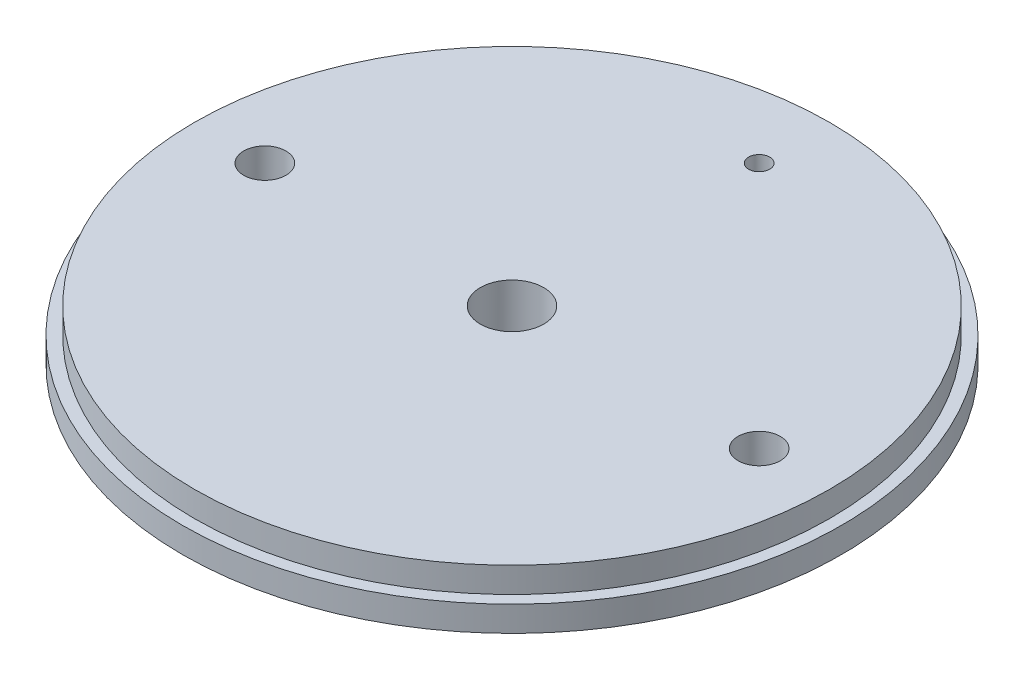
ISO-10303-21;
HEADER;
FILE_DESCRIPTION(('STEP AP214'),'2;1');
FILE_NAME('part.step','',(''),(''),'','','');
FILE_SCHEMA(('AUTOMOTIVE_DESIGN { 1 0 10303 214 1 1 1 1 }'));
ENDSEC;
DATA;
#1=APPLICATION_CONTEXT('core data for automotive mechanical design processes');
#2=APPLICATION_PROTOCOL_DEFINITION('international standard','automotive_design',2000,#1);
#3=PRODUCT_CONTEXT('',#1,'mechanical');
#4=PRODUCT('Part','Part','',(#3));
#5=PRODUCT_RELATED_PRODUCT_CATEGORY('part','',(#4));
#6=PRODUCT_DEFINITION_FORMATION('','',#4);
#7=PRODUCT_DEFINITION_CONTEXT('part definition',#1,'design');
#8=PRODUCT_DEFINITION('design','',#6,#7);
#9=PRODUCT_DEFINITION_SHAPE('','',#8);
#10=(LENGTH_UNIT() NAMED_UNIT(*) SI_UNIT(.MILLI.,.METRE.));
#11=(NAMED_UNIT(*) PLANE_ANGLE_UNIT() SI_UNIT($,.RADIAN.));
#12=(NAMED_UNIT(*) SI_UNIT($,.STERADIAN.) SOLID_ANGLE_UNIT());
#13=UNCERTAINTY_MEASURE_WITH_UNIT(LENGTH_MEASURE(1.E-05),#10,'distance_accuracy_value','');
#14=(GEOMETRIC_REPRESENTATION_CONTEXT(3) GLOBAL_UNCERTAINTY_ASSIGNED_CONTEXT((#13)) GLOBAL_UNIT_ASSIGNED_CONTEXT((#10,
#11,#12)) REPRESENTATION_CONTEXT('',''));
#15=CARTESIAN_POINT('',(0.,0.,0.));
#16=DIRECTION('',(0.,0.,1.));
#17=DIRECTION('',(1.,0.,0.));
#18=AXIS2_PLACEMENT_3D('',#15,#16,#17);
#19=CARTESIAN_POINT('',(0.,3.81,0.));
#20=DIRECTION('',(0.,-1.,0.));
#21=DIRECTION('',(0.,0.,-1.));
#22=AXIS2_PLACEMENT_3D('',#19,#20,#21);
#23=CYLINDRICAL_SURFACE('',#22,49.53);
#24=CARTESIAN_POINT('',(0.,3.81,0.));
#25=DIRECTION('',(0.,1.,0.));
#26=DIRECTION('',(0.,0.,1.));
#27=AXIS2_PLACEMENT_3D('',#24,#25,#26);
#28=CIRCLE('',#27,49.53);
#29=CARTESIAN_POINT('',(0.,3.81,-49.53));
#30=VERTEX_POINT('',#29);
#31=EDGE_CURVE('E50',#30,#30,#28,.T.);
#32=CARTESIAN_POINT('',(0.,0.,0.));
#33=DIRECTION('',(0.,1.,0.));
#34=DIRECTION('',(0.,0.,1.));
#35=AXIS2_PLACEMENT_3D('',#32,#33,#34);
#36=CIRCLE('',#35,49.53);
#37=CARTESIAN_POINT('',(0.,0.,-49.53));
#38=VERTEX_POINT('',#37);
#39=EDGE_CURVE('E56',#38,#38,#36,.T.);
#40=CARTESIAN_POINT('',(0.,3.81,-49.53));
#41=CARTESIAN_POINT('',(0.,3.7703125,-49.53));
#42=CARTESIAN_POINT('',(0.,3.730625,-49.53));
#43=CARTESIAN_POINT('',(0.,3.65125,-49.53));
#44=CARTESIAN_POINT('',(0.,3.6115625,-49.53));
#45=CARTESIAN_POINT('',(0.,3.5321875,-49.53));
#46=CARTESIAN_POINT('',(0.,3.4925,-49.53));
#47=CARTESIAN_POINT('',(0.,3.413125,-49.53));
#48=CARTESIAN_POINT('',(0.,3.3734375,-49.53));
#49=CARTESIAN_POINT('',(0.,3.2940625,-49.53));
#50=CARTESIAN_POINT('',(0.,3.254375,-49.53));
#51=CARTESIAN_POINT('',(0.,3.175,-49.53));
#52=CARTESIAN_POINT('',(0.,3.1353125,-49.53));
#53=CARTESIAN_POINT('',(0.,3.0559375,-49.53));
#54=CARTESIAN_POINT('',(0.,3.01625,-49.53));
#55=CARTESIAN_POINT('',(0.,2.936875,-49.53));
#56=CARTESIAN_POINT('',(0.,2.8971875,-49.53));
#57=CARTESIAN_POINT('',(0.,2.8178125,-49.53));
#58=CARTESIAN_POINT('',(0.,2.778125,-49.53));
#59=CARTESIAN_POINT('',(0.,2.69875,-49.53));
#60=CARTESIAN_POINT('',(0.,2.6590625,-49.53));
#61=CARTESIAN_POINT('',(0.,2.5796875,-49.53));
#62=CARTESIAN_POINT('',(0.,2.54,-49.53));
#63=CARTESIAN_POINT('',(0.,2.460625,-49.53));
#64=CARTESIAN_POINT('',(0.,2.4209375,-49.53));
#65=CARTESIAN_POINT('',(0.,2.3415625,-49.53));
#66=CARTESIAN_POINT('',(0.,2.301875,-49.53));
#67=CARTESIAN_POINT('',(0.,2.2225,-49.53));
#68=CARTESIAN_POINT('',(0.,2.1828125,-49.53));
#69=CARTESIAN_POINT('',(0.,2.1034375,-49.53));
#70=CARTESIAN_POINT('',(0.,2.06375,-49.53));
#71=CARTESIAN_POINT('',(0.,1.984375,-49.53));
#72=CARTESIAN_POINT('',(0.,1.9446875,-49.53));
#73=CARTESIAN_POINT('',(0.,1.8653125,-49.53));
#74=CARTESIAN_POINT('',(0.,1.825625,-49.53));
#75=CARTESIAN_POINT('',(0.,1.74625,-49.53));
#76=CARTESIAN_POINT('',(0.,1.7065625,-49.53));
#77=CARTESIAN_POINT('',(0.,1.6271875,-49.53));
#78=CARTESIAN_POINT('',(0.,1.5875,-49.53));
#79=CARTESIAN_POINT('',(0.,1.508125,-49.53));
#80=CARTESIAN_POINT('',(0.,1.4684375,-49.53));
#81=CARTESIAN_POINT('',(0.,1.3890625,-49.53));
#82=CARTESIAN_POINT('',(0.,1.349375,-49.53));
#83=CARTESIAN_POINT('',(0.,1.27,-49.53));
#84=CARTESIAN_POINT('',(0.,1.2303125,-49.53));
#85=CARTESIAN_POINT('',(0.,1.1509375,-49.53));
#86=CARTESIAN_POINT('',(0.,1.11125,-49.53));
#87=CARTESIAN_POINT('',(0.,1.031875,-49.53));
#88=CARTESIAN_POINT('',(0.,0.9921875,-49.53));
#89=CARTESIAN_POINT('',(0.,0.9128125,-49.53));
#90=CARTESIAN_POINT('',(0.,0.873125,-49.53));
#91=CARTESIAN_POINT('',(0.,0.79375,-49.53));
#92=CARTESIAN_POINT('',(0.,0.7540625,-49.53));
#93=CARTESIAN_POINT('',(0.,0.6746875,-49.53));
#94=CARTESIAN_POINT('',(0.,0.635,-49.53));
#95=CARTESIAN_POINT('',(0.,0.555625,-49.53));
#96=CARTESIAN_POINT('',(0.,0.5159375,-49.53));
#97=CARTESIAN_POINT('',(0.,0.4365625,-49.53));
#98=CARTESIAN_POINT('',(0.,0.396875,-49.53));
#99=CARTESIAN_POINT('',(0.,0.3175,-49.53));
#100=CARTESIAN_POINT('',(0.,0.2778125,-49.53));
#101=CARTESIAN_POINT('',(0.,0.1984375,-49.53));
#102=CARTESIAN_POINT('',(0.,0.15875,-49.53));
#103=CARTESIAN_POINT('',(0.,0.0793749999999999,-49.53));
#104=CARTESIAN_POINT('',(0.,0.0396874999999999,-49.53));
#105=CARTESIAN_POINT('',(0.,0.,-49.53));
#106=B_SPLINE_CURVE_WITH_KNOTS('',3,(#40,#41,#42,#43,#44,#45,#46,#47,#48,#49,#50,#51,#52,#53,
#54,#55,#56,#57,#58,#59,#60,#61,#62,#63,#64,#65,#66,#67,#68,#69,#70,#71,#72,#73,#74,#75,#76,#77,
#78,#79,#80,#81,#82,#83,#84,#85,#86,#87,#88,#89,#90,#91,#92,#93,#94,#95,#96,#97,#98,#99,#100,
#101,#102,#103,#104,#105),.UNSPECIFIED.,.F.,.F.,(4,2,2,2,2,2,2,2,2,2,2,2,2,2,2,2,2,2,2,2,2,2,2,
2,2,2,2,2,2,2,2,2,4),(0.,0.1190625,0.238125,0.3571875,0.47625,0.5953125,0.714375,0.8334375,
0.9525,1.0715625,1.190625,1.3096875,1.42875,1.5478125,1.666875,1.7859375,1.905,2.0240625,
2.143125,2.2621875,2.38125,2.5003125,2.619375,2.7384375,2.8575,2.9765625,3.095625,3.2146875,
3.33375,3.4528125,3.571875,3.6909375,3.81),.UNSPECIFIED.);
#107=EDGE_CURVE('BSEAM42',#30,#38,#106,.T.);
#108=ORIENTED_EDGE('',*,*,#31,.F.);
#109=ORIENTED_EDGE('',*,*,#39,.T.);
#110=ORIENTED_EDGE('',*,*,#107,.T.);
#111=ORIENTED_EDGE('',*,*,#107,.F.);
#112=EDGE_LOOP('',(#108,#110,#109,#111));
#113=FACE_BOUND('',#112,.T.);
#114=ADVANCED_FACE('F42',(#113),#23,.T.);
#115=CARTESIAN_POINT('',(0.,3.81,0.));
#116=DIRECTION('',(0.,1.,0.));
#117=DIRECTION('',(0.,0.,1.));
#118=AXIS2_PLACEMENT_3D('',#115,#116,#117);
#119=PLANE('',#118);
#120=CARTESIAN_POINT('',(0.,3.81,0.));
#121=DIRECTION('',(0.,1.,0.));
#122=DIRECTION('',(0.,0.,1.));
#123=AXIS2_PLACEMENT_3D('',#120,#121,#122);
#124=CIRCLE('',#123,47.752);
#125=CARTESIAN_POINT('',(0.,3.81,-47.752));
#126=VERTEX_POINT('',#125);
#127=EDGE_CURVE('E10',#126,#126,#124,.T.);
#128=ORIENTED_EDGE('',*,*,#127,.F.);
#129=EDGE_LOOP('',(#128));
#130=FACE_BOUND('',#129,.T.);
#131=ORIENTED_EDGE('',*,*,#31,.T.);
#132=EDGE_LOOP('',(#131));
#133=FACE_BOUND('',#132,.T.);
#134=ADVANCED_FACE('F97',(#130,#133),#119,.T.);
#135=CARTESIAN_POINT('',(0.,0.,0.));
#136=DIRECTION('',(0.,1.,0.));
#137=DIRECTION('',(0.,0.,1.));
#138=AXIS2_PLACEMENT_3D('',#135,#136,#137);
#139=PLANE('',#138);
#140=CARTESIAN_POINT('',(0.,0.,-37.1475));
#141=DIRECTION('',(0.,-1.,0.));
#142=DIRECTION('',(0.,0.,-1.));
#143=AXIS2_PLACEMENT_3D('',#140,#141,#142);
#144=CIRCLE('',#143,1.5875);
#145=CARTESIAN_POINT('',(0.,0.,-38.735));
#146=VERTEX_POINT('',#145);
#147=EDGE_CURVE('E177',#146,#146,#144,.T.);
#148=ORIENTED_EDGE('',*,*,#147,.F.);
#149=EDGE_LOOP('',(#148));
#150=FACE_BOUND('',#149,.T.);
#151=CARTESIAN_POINT('',(-37.1475,0.,0.));
#152=DIRECTION('',(0.,-1.,0.));
#153=DIRECTION('',(0.,0.,-1.));
#154=AXIS2_PLACEMENT_3D('',#151,#152,#153);
#155=CIRCLE('',#154,3.175);
#156=CARTESIAN_POINT('',(-37.1475,0.,-3.175));
#157=VERTEX_POINT('',#156);
#158=EDGE_CURVE('E70',#157,#157,#155,.T.);
#159=ORIENTED_EDGE('',*,*,#158,.F.);
#160=EDGE_LOOP('',(#159));
#161=FACE_BOUND('',#160,.T.);
#162=CARTESIAN_POINT('',(37.1475,0.,0.));
#163=DIRECTION('',(0.,-1.,0.));
#164=DIRECTION('',(0.,0.,-1.));
#165=AXIS2_PLACEMENT_3D('',#162,#163,#164);
#166=CIRCLE('',#165,3.175);
#167=CARTESIAN_POINT('',(37.1475,0.,-3.175));
#168=VERTEX_POINT('',#167);
#169=EDGE_CURVE('E186',#168,#168,#166,.T.);
#170=ORIENTED_EDGE('',*,*,#169,.F.);
#171=EDGE_LOOP('',(#170));
#172=FACE_BOUND('',#171,.T.);
#173=CARTESIAN_POINT('',(0.,0.,0.));
#174=DIRECTION('',(0.,-1.,0.));
#175=DIRECTION('',(0.,0.,-1.));
#176=AXIS2_PLACEMENT_3D('',#173,#174,#175);
#177=CIRCLE('',#176,4.7625);
#178=CARTESIAN_POINT('',(0.,0.,-4.7625));
#179=VERTEX_POINT('',#178);
#180=EDGE_CURVE('E181',#179,#179,#177,.T.);
#181=ORIENTED_EDGE('',*,*,#180,.F.);
#182=EDGE_LOOP('',(#181));
#183=FACE_BOUND('',#182,.T.);
#184=ORIENTED_EDGE('',*,*,#39,.F.);
#185=EDGE_LOOP('',(#184));
#186=FACE_BOUND('',#185,.T.);
#187=ADVANCED_FACE('F86',(#150,#161,#172,#183,#186),#139,.F.);
#188=CARTESIAN_POINT('',(0.,7.62,0.));
#189=DIRECTION('',(0.,-1.,0.));
#190=DIRECTION('',(0.,0.,-1.));
#191=AXIS2_PLACEMENT_3D('',#188,#189,#190);
#192=CYLINDRICAL_SURFACE('',#191,47.752);
#193=CARTESIAN_POINT('',(0.,7.62,0.));
#194=DIRECTION('',(0.,1.,0.));
#195=DIRECTION('',(0.,0.,1.));
#196=AXIS2_PLACEMENT_3D('',#193,#194,#195);
#197=CIRCLE('',#196,47.752);
#198=CARTESIAN_POINT('',(0.,7.62,-47.752));
#199=VERTEX_POINT('',#198);
#200=EDGE_CURVE('E59',#199,#199,#197,.T.);
#201=CARTESIAN_POINT('',(0.,7.62,-47.752));
#202=CARTESIAN_POINT('',(0.,7.5803125,-47.752));
#203=CARTESIAN_POINT('',(0.,7.540625,-47.752));
#204=CARTESIAN_POINT('',(0.,7.46125,-47.752));
#205=CARTESIAN_POINT('',(0.,7.4215625,-47.752));
#206=CARTESIAN_POINT('',(0.,7.3421875,-47.752));
#207=CARTESIAN_POINT('',(0.,7.3025,-47.752));
#208=CARTESIAN_POINT('',(0.,7.223125,-47.752));
#209=CARTESIAN_POINT('',(0.,7.1834375,-47.752));
#210=CARTESIAN_POINT('',(0.,7.1040625,-47.752));
#211=CARTESIAN_POINT('',(0.,7.064375,-47.752));
#212=CARTESIAN_POINT('',(0.,6.985,-47.752));
#213=CARTESIAN_POINT('',(0.,6.9453125,-47.752));
#214=CARTESIAN_POINT('',(0.,6.8659375,-47.752));
#215=CARTESIAN_POINT('',(0.,6.82625,-47.752));
#216=CARTESIAN_POINT('',(0.,6.746875,-47.752));
#217=CARTESIAN_POINT('',(0.,6.7071875,-47.752));
#218=CARTESIAN_POINT('',(0.,6.6278125,-47.752));
#219=CARTESIAN_POINT('',(0.,6.588125,-47.752));
#220=CARTESIAN_POINT('',(0.,6.50875,-47.752));
#221=CARTESIAN_POINT('',(0.,6.4690625,-47.752));
#222=CARTESIAN_POINT('',(0.,6.3896875,-47.752));
#223=CARTESIAN_POINT('',(0.,6.35,-47.752));
#224=CARTESIAN_POINT('',(0.,6.270625,-47.752));
#225=CARTESIAN_POINT('',(0.,6.2309375,-47.752));
#226=CARTESIAN_POINT('',(0.,6.1515625,-47.752));
#227=CARTESIAN_POINT('',(0.,6.111875,-47.752));
#228=CARTESIAN_POINT('',(0.,6.0325,-47.752));
#229=CARTESIAN_POINT('',(0.,5.9928125,-47.752));
#230=CARTESIAN_POINT('',(0.,5.9134375,-47.752));
#231=CARTESIAN_POINT('',(0.,5.87375,-47.752));
#232=CARTESIAN_POINT('',(0.,5.794375,-47.752));
#233=CARTESIAN_POINT('',(0.,5.7546875,-47.752));
#234=CARTESIAN_POINT('',(0.,5.6753125,-47.752));
#235=CARTESIAN_POINT('',(0.,5.635625,-47.752));
#236=CARTESIAN_POINT('',(0.,5.55625,-47.752));
#237=CARTESIAN_POINT('',(0.,5.5165625,-47.752));
#238=CARTESIAN_POINT('',(0.,5.4371875,-47.752));
#239=CARTESIAN_POINT('',(0.,5.3975,-47.752));
#240=CARTESIAN_POINT('',(0.,5.318125,-47.752));
#241=CARTESIAN_POINT('',(0.,5.2784375,-47.752));
#242=CARTESIAN_POINT('',(0.,5.1990625,-47.752));
#243=CARTESIAN_POINT('',(0.,5.159375,-47.752));
#244=CARTESIAN_POINT('',(0.,5.08,-47.752));
#245=CARTESIAN_POINT('',(0.,5.0403125,-47.752));
#246=CARTESIAN_POINT('',(0.,4.9609375,-47.752));
#247=CARTESIAN_POINT('',(0.,4.92125,-47.752));
#248=CARTESIAN_POINT('',(0.,4.841875,-47.752));
#249=CARTESIAN_POINT('',(0.,4.8021875,-47.752));
#250=CARTESIAN_POINT('',(0.,4.7228125,-47.752));
#251=CARTESIAN_POINT('',(0.,4.683125,-47.752));
#252=CARTESIAN_POINT('',(0.,4.60375,-47.752));
#253=CARTESIAN_POINT('',(0.,4.5640625,-47.752));
#254=CARTESIAN_POINT('',(0.,4.4846875,-47.752));
#255=CARTESIAN_POINT('',(0.,4.445,-47.752));
#256=CARTESIAN_POINT('',(0.,4.365625,-47.752));
#257=CARTESIAN_POINT('',(0.,4.3259375,-47.752));
#258=CARTESIAN_POINT('',(0.,4.2465625,-47.752));
#259=CARTESIAN_POINT('',(0.,4.206875,-47.752));
#260=CARTESIAN_POINT('',(0.,4.1275,-47.752));
#261=CARTESIAN_POINT('',(0.,4.0878125,-47.752));
#262=CARTESIAN_POINT('',(0.,4.0084375,-47.752));
#263=CARTESIAN_POINT('',(0.,3.96875,-47.752));
#264=CARTESIAN_POINT('',(0.,3.889375,-47.752));
#265=CARTESIAN_POINT('',(0.,3.8496875,-47.752));
#266=CARTESIAN_POINT('',(0.,3.81,-47.752));
#267=B_SPLINE_CURVE_WITH_KNOTS('',3,(#201,#202,#203,#204,#205,#206,#207,#208,#209,#210,#211,
#212,#213,#214,#215,#216,#217,#218,#219,#220,#221,#222,#223,#224,#225,#226,#227,#228,#229,#230,
#231,#232,#233,#234,#235,#236,#237,#238,#239,#240,#241,#242,#243,#244,#245,#246,#247,#248,#249,
#250,#251,#252,#253,#254,#255,#256,#257,#258,#259,#260,#261,#262,#263,#264,#265,#266),
.UNSPECIFIED.,.F.,.F.,(4,2,2,2,2,2,2,2,2,2,2,2,2,2,2,2,2,2,2,2,2,2,2,2,2,2,2,2,2,2,2,2,4),(0.,
0.1190625,0.238125,0.357187500000001,0.47625,0.5953125,0.714375000000001,0.8334375,0.9525,
1.0715625,1.190625,1.3096875,1.42875,1.5478125,1.666875,1.7859375,1.905,2.0240625,2.143125,
2.2621875,2.38125,2.5003125,2.619375,2.7384375,2.8575,2.9765625,3.095625,3.2146875,3.33375,
3.4528125,3.571875,3.6909375,3.81),.UNSPECIFIED.);
#268=EDGE_CURVE('BSEAM84',#199,#126,#267,.T.);
#269=ORIENTED_EDGE('',*,*,#200,.F.);
#270=ORIENTED_EDGE('',*,*,#127,.T.);
#271=ORIENTED_EDGE('',*,*,#268,.T.);
#272=ORIENTED_EDGE('',*,*,#268,.F.);
#273=EDGE_LOOP('',(#269,#271,#270,#272));
#274=FACE_BOUND('',#273,.T.);
#275=ADVANCED_FACE('F84',(#274),#192,.T.);
#276=CARTESIAN_POINT('',(0.,7.62,0.));
#277=DIRECTION('',(0.,1.,0.));
#278=DIRECTION('',(0.,0.,1.));
#279=AXIS2_PLACEMENT_3D('',#276,#277,#278);
#280=PLANE('',#279);
#281=CARTESIAN_POINT('',(0.,7.62,-37.1475));
#282=DIRECTION('',(0.,1.,0.));
#283=DIRECTION('',(0.,0.,1.));
#284=AXIS2_PLACEMENT_3D('',#281,#282,#283);
#285=CIRCLE('',#284,1.5875);
#286=CARTESIAN_POINT('',(0.,7.62,-35.56));
#287=VERTEX_POINT('',#286);
#288=EDGE_CURVE('E45',#287,#287,#285,.T.);
#289=ORIENTED_EDGE('',*,*,#288,.F.);
#290=EDGE_LOOP('',(#289));
#291=FACE_BOUND('',#290,.T.);
#292=CARTESIAN_POINT('',(-37.1475,7.62,0.));
#293=DIRECTION('',(0.,1.,0.));
#294=DIRECTION('',(0.,0.,1.));
#295=AXIS2_PLACEMENT_3D('',#292,#293,#294);
#296=CIRCLE('',#295,3.175);
#297=CARTESIAN_POINT('',(-37.1475,7.62,3.175));
#298=VERTEX_POINT('',#297);
#299=EDGE_CURVE('E73',#298,#298,#296,.T.);
#300=ORIENTED_EDGE('',*,*,#299,.F.);
#301=EDGE_LOOP('',(#300));
#302=FACE_BOUND('',#301,.T.);
#303=CARTESIAN_POINT('',(37.1475,7.62,0.));
#304=DIRECTION('',(0.,1.,0.));
#305=DIRECTION('',(0.,0.,1.));
#306=AXIS2_PLACEMENT_3D('',#303,#304,#305);
#307=CIRCLE('',#306,3.175);
#308=CARTESIAN_POINT('',(37.1475,7.62,3.175));
#309=VERTEX_POINT('',#308);
#310=EDGE_CURVE('E69',#309,#309,#307,.T.);
#311=ORIENTED_EDGE('',*,*,#310,.F.);
#312=EDGE_LOOP('',(#311));
#313=FACE_BOUND('',#312,.T.);
#314=CARTESIAN_POINT('',(0.,7.62,0.));
#315=DIRECTION('',(0.,1.,0.));
#316=DIRECTION('',(0.,0.,1.));
#317=AXIS2_PLACEMENT_3D('',#314,#315,#316);
#318=CIRCLE('',#317,4.7625);
#319=CARTESIAN_POINT('',(0.,7.62,4.7625));
#320=VERTEX_POINT('',#319);
#321=EDGE_CURVE('E65',#320,#320,#318,.T.);
#322=ORIENTED_EDGE('',*,*,#321,.F.);
#323=EDGE_LOOP('',(#322));
#324=FACE_BOUND('',#323,.T.);
#325=ORIENTED_EDGE('',*,*,#200,.T.);
#326=EDGE_LOOP('',(#325));
#327=FACE_BOUND('',#326,.T.);
#328=ADVANCED_FACE('F82',(#291,#302,#313,#324,#327),#280,.T.);
#329=CARTESIAN_POINT('',(0.,10.922,0.));
#330=DIRECTION('',(0.,-1.,0.));
#331=DIRECTION('',(0.,0.,-1.));
#332=AXIS2_PLACEMENT_3D('',#329,#330,#331);
#333=CYLINDRICAL_SURFACE('',#332,4.7625);
#334=ORIENTED_EDGE('',*,*,#321,.T.);
#335=EDGE_LOOP('',(#334));
#336=FACE_BOUND('',#335,.T.);
#337=ORIENTED_EDGE('',*,*,#180,.T.);
#338=EDGE_LOOP('',(#337));
#339=FACE_BOUND('',#338,.T.);
#340=ADVANCED_FACE('F93',(#336,#339),#333,.F.);
#341=CARTESIAN_POINT('',(37.1475,10.922,0.));
#342=DIRECTION('',(0.,-1.,0.));
#343=DIRECTION('',(0.,0.,-1.));
#344=AXIS2_PLACEMENT_3D('',#341,#342,#343);
#345=CYLINDRICAL_SURFACE('',#344,3.175);
#346=ORIENTED_EDGE('',*,*,#310,.T.);
#347=EDGE_LOOP('',(#346));
#348=FACE_BOUND('',#347,.T.);
#349=ORIENTED_EDGE('',*,*,#169,.T.);
#350=EDGE_LOOP('',(#349));
#351=FACE_BOUND('',#350,.T.);
#352=ADVANCED_FACE('F142',(#348,#351),#345,.F.);
#353=CARTESIAN_POINT('',(-37.1475,10.922,0.));
#354=DIRECTION('',(0.,-1.,0.));
#355=DIRECTION('',(0.,0.,-1.));
#356=AXIS2_PLACEMENT_3D('',#353,#354,#355);
#357=CYLINDRICAL_SURFACE('',#356,3.175);
#358=ORIENTED_EDGE('',*,*,#299,.T.);
#359=EDGE_LOOP('',(#358));
#360=FACE_BOUND('',#359,.T.);
#361=ORIENTED_EDGE('',*,*,#158,.T.);
#362=EDGE_LOOP('',(#361));
#363=FACE_BOUND('',#362,.T.);
#364=ADVANCED_FACE('F152',(#360,#363),#357,.F.);
#365=CARTESIAN_POINT('',(0.,40.64,-37.1475));
#366=DIRECTION('',(0.,-1.,0.));
#367=DIRECTION('',(0.,0.,-1.));
#368=AXIS2_PLACEMENT_3D('',#365,#366,#367);
#369=CYLINDRICAL_SURFACE('',#368,1.5875);
#370=ORIENTED_EDGE('',*,*,#288,.T.);
#371=EDGE_LOOP('',(#370));
#372=FACE_BOUND('',#371,.T.);
#373=ORIENTED_EDGE('',*,*,#147,.T.);
#374=EDGE_LOOP('',(#373));
#375=FACE_BOUND('',#374,.T.);
#376=ADVANCED_FACE('F161',(#372,#375),#369,.F.);
#377=CLOSED_SHELL('',(#114,#134,#187,#275,#328,#340,#352,#364,#376));
#378=MANIFOLD_SOLID_BREP('B2',#377);
#379=ADVANCED_BREP_SHAPE_REPRESENTATION('',(#18,#378),#14);
#380=SHAPE_DEFINITION_REPRESENTATION(#9,#379);
ENDSEC;
END-ISO-10303-21;
